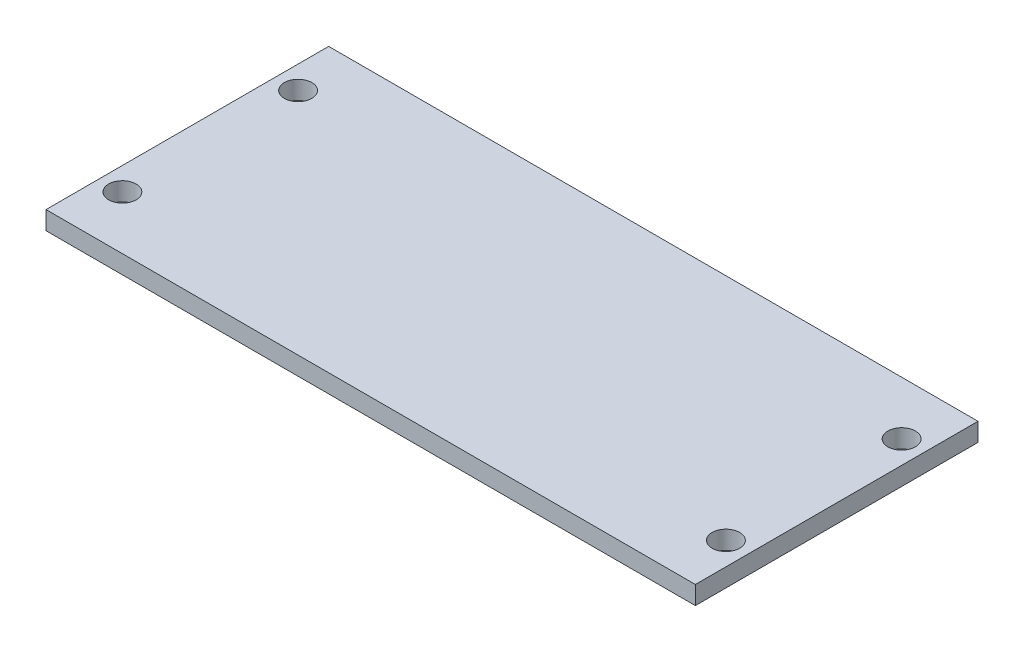
ISO-10303-21;
HEADER;
FILE_DESCRIPTION(('STEP AP214'),'2;1');
FILE_NAME('part.step','',(''),(''),'','','');
FILE_SCHEMA(('AUTOMOTIVE_DESIGN { 1 0 10303 214 1 1 1 1 }'));
ENDSEC;
DATA;
#1=APPLICATION_CONTEXT('core data for automotive mechanical design processes');
#2=APPLICATION_PROTOCOL_DEFINITION('international standard','automotive_design',2000,#1);
#3=PRODUCT_CONTEXT('',#1,'mechanical');
#4=PRODUCT('Part','Part','',(#3));
#5=PRODUCT_RELATED_PRODUCT_CATEGORY('part','',(#4));
#6=PRODUCT_DEFINITION_FORMATION('','',#4);
#7=PRODUCT_DEFINITION_CONTEXT('part definition',#1,'design');
#8=PRODUCT_DEFINITION('design','',#6,#7);
#9=PRODUCT_DEFINITION_SHAPE('','',#8);
#10=(LENGTH_UNIT() NAMED_UNIT(*) SI_UNIT(.MILLI.,.METRE.));
#11=(NAMED_UNIT(*) PLANE_ANGLE_UNIT() SI_UNIT($,.RADIAN.));
#12=(NAMED_UNIT(*) SI_UNIT($,.STERADIAN.) SOLID_ANGLE_UNIT());
#13=UNCERTAINTY_MEASURE_WITH_UNIT(LENGTH_MEASURE(1.E-05),#10,'distance_accuracy_value','');
#14=(GEOMETRIC_REPRESENTATION_CONTEXT(3) GLOBAL_UNCERTAINTY_ASSIGNED_CONTEXT((#13)) GLOBAL_UNIT_ASSIGNED_CONTEXT((#10,
#11,#12)) REPRESENTATION_CONTEXT('',''));
#15=CARTESIAN_POINT('',(0.,0.,0.));
#16=DIRECTION('',(0.,0.,1.));
#17=DIRECTION('',(1.,0.,0.));
#18=AXIS2_PLACEMENT_3D('',#15,#16,#17);
#19=CARTESIAN_POINT('',(0.,12.,0.));
#20=DIRECTION('',(0.,-1.,0.));
#21=DIRECTION('',(0.,0.,-1.));
#22=AXIS2_PLACEMENT_3D('',#19,#20,#21);
#23=PLANE('',#22);
#24=DIRECTION('',(0.,0.,-1.));
#25=VECTOR('',#24,1.);
#26=CARTESIAN_POINT('',(212.5,12.,92.5));
#27=LINE('',#26,#25);
#28=CARTESIAN_POINT('',(212.5,12.,92.5));
#29=VERTEX_POINT('',#28);
#30=CARTESIAN_POINT('',(212.5,12.,-92.5));
#31=VERTEX_POINT('',#30);
#32=EDGE_CURVE('E98',#29,#31,#27,.T.);
#33=ORIENTED_EDGE('',*,*,#32,.T.);
#34=DIRECTION('',(-1.,0.,0.));
#35=VECTOR('',#34,1.);
#36=CARTESIAN_POINT('',(-212.5,12.,-92.5));
#37=LINE('',#36,#35);
#38=CARTESIAN_POINT('',(-212.5,12.,-92.5));
#39=VERTEX_POINT('',#38);
#40=EDGE_CURVE('E93',#31,#39,#37,.T.);
#41=ORIENTED_EDGE('',*,*,#40,.T.);
#42=DIRECTION('',(0.,0.,1.));
#43=VECTOR('',#42,1.);
#44=CARTESIAN_POINT('',(-212.5,12.,92.5));
#45=LINE('',#44,#43);
#46=CARTESIAN_POINT('',(-212.5,12.,92.5));
#47=VERTEX_POINT('',#46);
#48=EDGE_CURVE('E96',#39,#47,#45,.T.);
#49=ORIENTED_EDGE('',*,*,#48,.T.);
#50=DIRECTION('',(1.,0.,0.));
#51=VECTOR('',#50,1.);
#52=CARTESIAN_POINT('',(-212.5,12.,92.5));
#53=LINE('',#52,#51);
#54=EDGE_CURVE('E63',#47,#29,#53,.T.);
#55=ORIENTED_EDGE('',*,*,#54,.T.);
#56=EDGE_LOOP('',(#33,#41,#49,#55));
#57=FACE_BOUND('',#56,.T.);
#58=CARTESIAN_POINT('',(-197.5,12.,-57.5));
#59=DIRECTION('',(0.,1.,0.));
#60=DIRECTION('',(0.,0.,1.));
#61=AXIS2_PLACEMENT_3D('',#58,#59,#60);
#62=CIRCLE('',#61,9.00000000000001);
#63=CARTESIAN_POINT('',(-197.5,12.,-48.5));
#64=VERTEX_POINT('',#63);
#65=EDGE_CURVE('E118',#64,#64,#62,.T.);
#66=ORIENTED_EDGE('',*,*,#65,.F.);
#67=EDGE_LOOP('',(#66));
#68=FACE_BOUND('',#67,.T.);
#69=CARTESIAN_POINT('',(-197.5,12.,57.5));
#70=DIRECTION('',(0.,1.,0.));
#71=DIRECTION('',(0.,0.,1.));
#72=AXIS2_PLACEMENT_3D('',#69,#70,#71);
#73=CIRCLE('',#72,9.00000000000001);
#74=CARTESIAN_POINT('',(-197.5,12.,66.5));
#75=VERTEX_POINT('',#74);
#76=EDGE_CURVE('E140',#75,#75,#73,.T.);
#77=ORIENTED_EDGE('',*,*,#76,.F.);
#78=EDGE_LOOP('',(#77));
#79=FACE_BOUND('',#78,.T.);
#80=CARTESIAN_POINT('',(197.5,12.,-57.5));
#81=DIRECTION('',(0.,1.,0.));
#82=DIRECTION('',(0.,0.,-1.));
#83=AXIS2_PLACEMENT_3D('',#80,#81,#82);
#84=CIRCLE('',#83,9.00000000000001);
#85=CARTESIAN_POINT('',(197.5,12.,-66.5000000000001));
#86=VERTEX_POINT('',#85);
#87=EDGE_CURVE('E148',#86,#86,#84,.T.);
#88=ORIENTED_EDGE('',*,*,#87,.F.);
#89=EDGE_LOOP('',(#88));
#90=FACE_BOUND('',#89,.T.);
#91=CARTESIAN_POINT('',(197.5,12.,57.5));
#92=DIRECTION('',(0.,1.,0.));
#93=DIRECTION('',(0.,0.,-1.));
#94=AXIS2_PLACEMENT_3D('',#91,#92,#93);
#95=CIRCLE('',#94,9.00000000000001);
#96=CARTESIAN_POINT('',(197.5,12.,48.5));
#97=VERTEX_POINT('',#96);
#98=EDGE_CURVE('E156',#97,#97,#95,.T.);
#99=ORIENTED_EDGE('',*,*,#98,.F.);
#100=EDGE_LOOP('',(#99));
#101=FACE_BOUND('',#100,.T.);
#102=ADVANCED_FACE('F45',(#57,#68,#79,#90,#101),#23,.F.);
#103=CARTESIAN_POINT('',(0.,0.,0.));
#104=DIRECTION('',(0.,-1.,0.));
#105=DIRECTION('',(0.,0.,-1.));
#106=AXIS2_PLACEMENT_3D('',#103,#104,#105);
#107=PLANE('',#106);
#108=CARTESIAN_POINT('',(197.5,0.,-57.5));
#109=DIRECTION('',(0.,1.,0.));
#110=DIRECTION('',(0.,0.,-1.));
#111=AXIS2_PLACEMENT_3D('',#108,#109,#110);
#112=CIRCLE('',#111,9.00000000000001);
#113=CARTESIAN_POINT('',(197.5,0.,-66.5000000000001));
#114=VERTEX_POINT('',#113);
#115=EDGE_CURVE('E152',#114,#114,#112,.T.);
#116=ORIENTED_EDGE('',*,*,#115,.T.);
#117=EDGE_LOOP('',(#116));
#118=FACE_BOUND('',#117,.T.);
#119=CARTESIAN_POINT('',(-197.5,0.,-57.5));
#120=DIRECTION('',(0.,1.,0.));
#121=DIRECTION('',(0.,0.,1.));
#122=AXIS2_PLACEMENT_3D('',#119,#120,#121);
#123=CIRCLE('',#122,9.00000000000001);
#124=CARTESIAN_POINT('',(-197.5,0.,-48.5));
#125=VERTEX_POINT('',#124);
#126=EDGE_CURVE('E136',#125,#125,#123,.T.);
#127=ORIENTED_EDGE('',*,*,#126,.T.);
#128=EDGE_LOOP('',(#127));
#129=FACE_BOUND('',#128,.T.);
#130=DIRECTION('',(0.,0.,-1.));
#131=VECTOR('',#130,1.);
#132=CARTESIAN_POINT('',(212.5,0.,92.5));
#133=LINE('',#132,#131);
#134=CARTESIAN_POINT('',(212.5,0.,92.5));
#135=VERTEX_POINT('',#134);
#136=CARTESIAN_POINT('',(212.5,0.,-92.5));
#137=VERTEX_POINT('',#136);
#138=EDGE_CURVE('E114',#135,#137,#133,.T.);
#139=ORIENTED_EDGE('',*,*,#138,.F.);
#140=DIRECTION('',(1.,0.,0.));
#141=VECTOR('',#140,1.);
#142=CARTESIAN_POINT('',(-212.5,0.,92.5));
#143=LINE('',#142,#141);
#144=CARTESIAN_POINT('',(-212.5,0.,92.5));
#145=VERTEX_POINT('',#144);
#146=EDGE_CURVE('E86',#145,#135,#143,.T.);
#147=ORIENTED_EDGE('',*,*,#146,.F.);
#148=DIRECTION('',(0.,0.,1.));
#149=VECTOR('',#148,1.);
#150=CARTESIAN_POINT('',(-212.5,0.,92.5));
#151=LINE('',#150,#149);
#152=CARTESIAN_POINT('',(-212.5,0.,-92.5));
#153=VERTEX_POINT('',#152);
#154=EDGE_CURVE('E80',#153,#145,#151,.T.);
#155=ORIENTED_EDGE('',*,*,#154,.F.);
#156=DIRECTION('',(-1.,0.,0.));
#157=VECTOR('',#156,1.);
#158=CARTESIAN_POINT('',(-212.5,0.,-92.5));
#159=LINE('',#158,#157);
#160=EDGE_CURVE('E103',#137,#153,#159,.T.);
#161=ORIENTED_EDGE('',*,*,#160,.F.);
#162=EDGE_LOOP('',(#139,#147,#155,#161));
#163=FACE_BOUND('',#162,.T.);
#164=CARTESIAN_POINT('',(-197.5,0.,57.5));
#165=DIRECTION('',(0.,1.,0.));
#166=DIRECTION('',(0.,0.,1.));
#167=AXIS2_PLACEMENT_3D('',#164,#165,#166);
#168=CIRCLE('',#167,9.00000000000001);
#169=CARTESIAN_POINT('',(-197.5,0.,66.5));
#170=VERTEX_POINT('',#169);
#171=EDGE_CURVE('E144',#170,#170,#168,.T.);
#172=ORIENTED_EDGE('',*,*,#171,.T.);
#173=EDGE_LOOP('',(#172));
#174=FACE_BOUND('',#173,.T.);
#175=CARTESIAN_POINT('',(197.5,0.,57.5));
#176=DIRECTION('',(0.,1.,0.));
#177=DIRECTION('',(0.,0.,-1.));
#178=AXIS2_PLACEMENT_3D('',#175,#176,#177);
#179=CIRCLE('',#178,9.00000000000001);
#180=CARTESIAN_POINT('',(197.5,0.,48.5));
#181=VERTEX_POINT('',#180);
#182=EDGE_CURVE('E160',#181,#181,#179,.T.);
#183=ORIENTED_EDGE('',*,*,#182,.T.);
#184=EDGE_LOOP('',(#183));
#185=FACE_BOUND('',#184,.T.);
#186=ADVANCED_FACE('F131',(#118,#129,#163,#174,#185),#107,.T.);
#187=CARTESIAN_POINT('',(212.5,12.,92.5));
#188=DIRECTION('',(-1.,0.,0.));
#189=DIRECTION('',(0.,0.,1.));
#190=AXIS2_PLACEMENT_3D('',#187,#188,#189);
#191=PLANE('',#190);
#192=ORIENTED_EDGE('',*,*,#138,.T.);
#193=DIRECTION('',(0.,-1.,0.));
#194=VECTOR('',#193,1.);
#195=CARTESIAN_POINT('',(212.5,12.,-92.5));
#196=LINE('',#195,#194);
#197=EDGE_CURVE('E11',#31,#137,#196,.T.);
#198=ORIENTED_EDGE('',*,*,#197,.F.);
#199=ORIENTED_EDGE('',*,*,#32,.F.);
#200=DIRECTION('',(0.,-1.,0.));
#201=VECTOR('',#200,1.);
#202=CARTESIAN_POINT('',(212.5,12.,92.5));
#203=LINE('',#202,#201);
#204=EDGE_CURVE('E110',#29,#135,#203,.T.);
#205=ORIENTED_EDGE('',*,*,#204,.T.);
#206=EDGE_LOOP('',(#192,#198,#199,#205));
#207=FACE_BOUND('',#206,.T.);
#208=ADVANCED_FACE('F47',(#207),#191,.F.);
#209=CARTESIAN_POINT('',(-212.5,12.,-92.5));
#210=DIRECTION('',(0.,0.,1.));
#211=DIRECTION('',(1.,0.,0.));
#212=AXIS2_PLACEMENT_3D('',#209,#210,#211);
#213=PLANE('',#212);
#214=ORIENTED_EDGE('',*,*,#160,.T.);
#215=DIRECTION('',(0.,-1.,0.));
#216=VECTOR('',#215,1.);
#217=CARTESIAN_POINT('',(-212.5,12.,-92.5));
#218=LINE('',#217,#216);
#219=EDGE_CURVE('E55',#39,#153,#218,.T.);
#220=ORIENTED_EDGE('',*,*,#219,.F.);
#221=ORIENTED_EDGE('',*,*,#40,.F.);
#222=ORIENTED_EDGE('',*,*,#197,.T.);
#223=EDGE_LOOP('',(#214,#220,#221,#222));
#224=FACE_BOUND('',#223,.T.);
#225=ADVANCED_FACE('F102',(#224),#213,.F.);
#226=CARTESIAN_POINT('',(-212.5,12.,92.5));
#227=DIRECTION('',(1.,0.,0.));
#228=DIRECTION('',(0.,0.,-1.));
#229=AXIS2_PLACEMENT_3D('',#226,#227,#228);
#230=PLANE('',#229);
#231=ORIENTED_EDGE('',*,*,#154,.T.);
#232=DIRECTION('',(0.,-1.,0.));
#233=VECTOR('',#232,1.);
#234=CARTESIAN_POINT('',(-212.5,12.,92.5));
#235=LINE('',#234,#233);
#236=EDGE_CURVE('E105',#47,#145,#235,.T.);
#237=ORIENTED_EDGE('',*,*,#236,.F.);
#238=ORIENTED_EDGE('',*,*,#48,.F.);
#239=ORIENTED_EDGE('',*,*,#219,.T.);
#240=EDGE_LOOP('',(#231,#237,#238,#239));
#241=FACE_BOUND('',#240,.T.);
#242=ADVANCED_FACE('F106',(#241),#230,.F.);
#243=CARTESIAN_POINT('',(-212.5,12.,92.5));
#244=DIRECTION('',(0.,0.,-1.));
#245=DIRECTION('',(-1.,0.,0.));
#246=AXIS2_PLACEMENT_3D('',#243,#244,#245);
#247=PLANE('',#246);
#248=ORIENTED_EDGE('',*,*,#146,.T.);
#249=ORIENTED_EDGE('',*,*,#204,.F.);
#250=ORIENTED_EDGE('',*,*,#54,.F.);
#251=ORIENTED_EDGE('',*,*,#236,.T.);
#252=EDGE_LOOP('',(#248,#249,#250,#251));
#253=FACE_BOUND('',#252,.T.);
#254=ADVANCED_FACE('F128',(#253),#247,.F.);
#255=CARTESIAN_POINT('',(-197.5,12.,-57.5));
#256=DIRECTION('',(0.,-1.,0.));
#257=DIRECTION('',(0.,0.,-1.));
#258=AXIS2_PLACEMENT_3D('',#255,#256,#257);
#259=CYLINDRICAL_SURFACE('',#258,9.00000000000001);
#260=ORIENTED_EDGE('',*,*,#65,.T.);
#261=EDGE_LOOP('',(#260));
#262=FACE_BOUND('',#261,.T.);
#263=ORIENTED_EDGE('',*,*,#126,.F.);
#264=EDGE_LOOP('',(#263));
#265=FACE_BOUND('',#264,.T.);
#266=ADVANCED_FACE('F179',(#262,#265),#259,.F.);
#267=CARTESIAN_POINT('',(-197.5,12.,57.5));
#268=DIRECTION('',(0.,-1.,0.));
#269=DIRECTION('',(0.,0.,-1.));
#270=AXIS2_PLACEMENT_3D('',#267,#268,#269);
#271=CYLINDRICAL_SURFACE('',#270,9.00000000000001);
#272=ORIENTED_EDGE('',*,*,#76,.T.);
#273=EDGE_LOOP('',(#272));
#274=FACE_BOUND('',#273,.T.);
#275=ORIENTED_EDGE('',*,*,#171,.F.);
#276=EDGE_LOOP('',(#275));
#277=FACE_BOUND('',#276,.T.);
#278=ADVANCED_FACE('F224',(#274,#277),#271,.F.);
#279=CARTESIAN_POINT('',(197.5,12.,-57.5));
#280=DIRECTION('',(0.,-1.,0.));
#281=DIRECTION('',(0.,0.,-1.));
#282=AXIS2_PLACEMENT_3D('',#279,#280,#281);
#283=CYLINDRICAL_SURFACE('',#282,9.00000000000001);
#284=ORIENTED_EDGE('',*,*,#87,.T.);
#285=EDGE_LOOP('',(#284));
#286=FACE_BOUND('',#285,.T.);
#287=ORIENTED_EDGE('',*,*,#115,.F.);
#288=EDGE_LOOP('',(#287));
#289=FACE_BOUND('',#288,.T.);
#290=ADVANCED_FACE('F232',(#286,#289),#283,.F.);
#291=CARTESIAN_POINT('',(197.5,12.,57.5));
#292=DIRECTION('',(0.,-1.,0.));
#293=DIRECTION('',(0.,0.,-1.));
#294=AXIS2_PLACEMENT_3D('',#291,#292,#293);
#295=CYLINDRICAL_SURFACE('',#294,9.00000000000001);
#296=ORIENTED_EDGE('',*,*,#98,.T.);
#297=EDGE_LOOP('',(#296));
#298=FACE_BOUND('',#297,.T.);
#299=ORIENTED_EDGE('',*,*,#182,.F.);
#300=EDGE_LOOP('',(#299));
#301=FACE_BOUND('',#300,.T.);
#302=ADVANCED_FACE('F168',(#298,#301),#295,.F.);
#303=CLOSED_SHELL('',(#102,#186,#208,#225,#242,#254,#266,#278,#290,#302));
#304=MANIFOLD_SOLID_BREP('B2',#303);
#305=ADVANCED_BREP_SHAPE_REPRESENTATION('',(#18,#304),#14);
#306=SHAPE_DEFINITION_REPRESENTATION(#9,#305);
ENDSEC;
END-ISO-10303-21;
